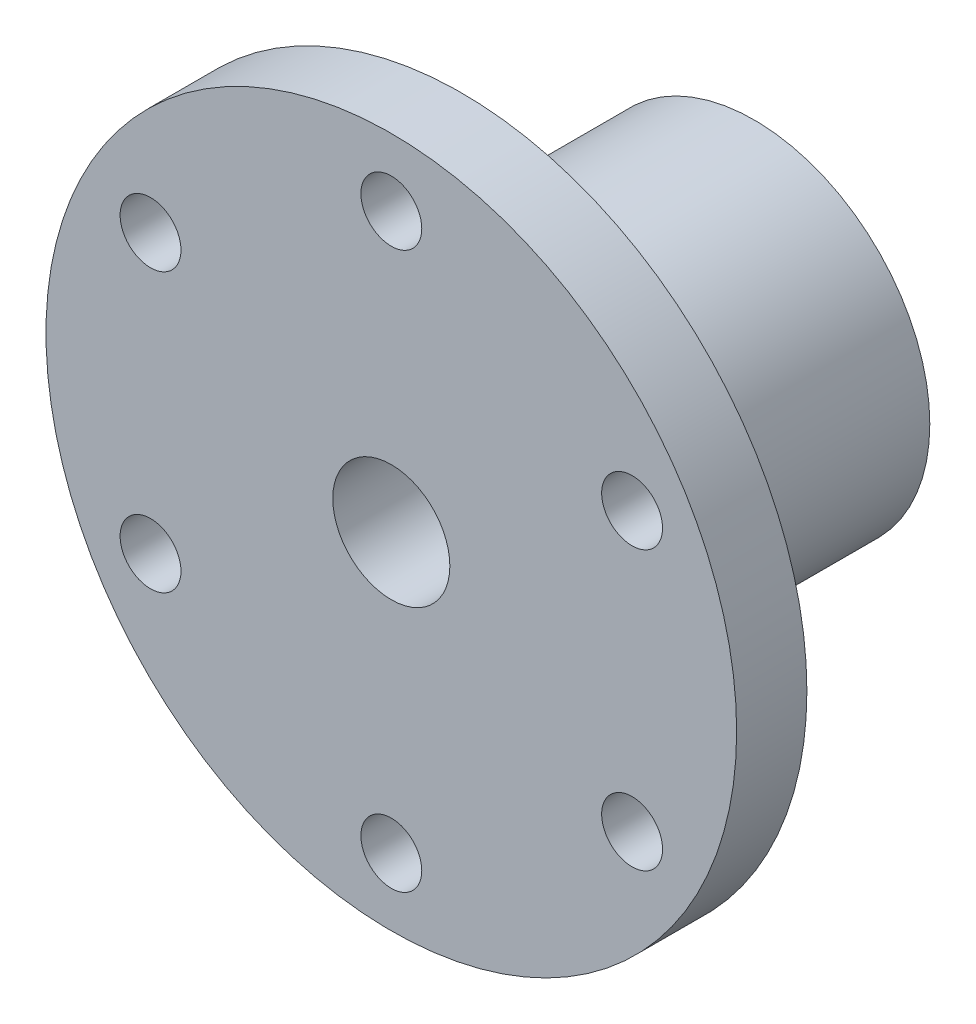
ISO-10303-21;
HEADER;
FILE_DESCRIPTION(('STEP AP214'),'2;1');
FILE_NAME('part.step','',(''),(''),'','','');
FILE_SCHEMA(('AUTOMOTIVE_DESIGN { 1 0 10303 214 1 1 1 1 }'));
ENDSEC;
DATA;
#1=APPLICATION_CONTEXT('core data for automotive mechanical design processes');
#2=APPLICATION_PROTOCOL_DEFINITION('international standard','automotive_design',2000,#1);
#3=PRODUCT_CONTEXT('',#1,'mechanical');
#4=PRODUCT('Part','Part','',(#3));
#5=PRODUCT_RELATED_PRODUCT_CATEGORY('part','',(#4));
#6=PRODUCT_DEFINITION_FORMATION('','',#4);
#7=PRODUCT_DEFINITION_CONTEXT('part definition',#1,'design');
#8=PRODUCT_DEFINITION('design','',#6,#7);
#9=PRODUCT_DEFINITION_SHAPE('','',#8);
#10=(LENGTH_UNIT() NAMED_UNIT(*) SI_UNIT(.MILLI.,.METRE.));
#11=(NAMED_UNIT(*) PLANE_ANGLE_UNIT() SI_UNIT($,.RADIAN.));
#12=(NAMED_UNIT(*) SI_UNIT($,.STERADIAN.) SOLID_ANGLE_UNIT());
#13=UNCERTAINTY_MEASURE_WITH_UNIT(LENGTH_MEASURE(1.E-05),#10,'distance_accuracy_value','');
#14=(GEOMETRIC_REPRESENTATION_CONTEXT(3) GLOBAL_UNCERTAINTY_ASSIGNED_CONTEXT((#13)) GLOBAL_UNIT_ASSIGNED_CONTEXT((#10,
#11,#12)) REPRESENTATION_CONTEXT('',''));
#15=CARTESIAN_POINT('',(0.,0.,0.));
#16=DIRECTION('',(0.,0.,1.));
#17=DIRECTION('',(1.,0.,0.));
#18=AXIS2_PLACEMENT_3D('',#15,#16,#17);
#19=CARTESIAN_POINT('',(0.,0.,6.));
#20=DIRECTION('',(0.,0.,1.));
#21=DIRECTION('',(1.,0.,0.));
#22=AXIS2_PLACEMENT_3D('',#19,#20,#21);
#23=PLANE('',#22);
#24=CARTESIAN_POINT('',(0.,0.,6.));
#25=DIRECTION('',(0.,0.,1.));
#26=DIRECTION('',(1.,0.,0.));
#27=AXIS2_PLACEMENT_3D('',#24,#25,#26);
#28=CIRCLE('',#27,5.);
#29=CARTESIAN_POINT('',(5.,0.,6.));
#30=VERTEX_POINT('',#29);
#31=EDGE_CURVE('E100',#30,#30,#28,.F.);
#32=ORIENTED_EDGE('',*,*,#31,.T.);
#33=EDGE_LOOP('',(#32));
#34=FACE_BOUND('',#33,.T.);
#35=CARTESIAN_POINT('',(-20.5681033398805,-11.8749999999998,6.));
#36=DIRECTION('',(0.,0.,1.));
#37=DIRECTION('',(1.,0.,0.));
#38=AXIS2_PLACEMENT_3D('',#35,#36,#37);
#39=CIRCLE('',#38,2.6);
#40=CARTESIAN_POINT('',(-17.9681033398805,-11.8749999999998,6.));
#41=VERTEX_POINT('',#40);
#42=EDGE_CURVE('E83',#41,#41,#39,.T.);
#43=ORIENTED_EDGE('',*,*,#42,.F.);
#44=EDGE_LOOP('',(#43));
#45=FACE_BOUND('',#44,.T.);
#46=CARTESIAN_POINT('',(20.5681033398804,-11.8750000000001,6.));
#47=DIRECTION('',(0.,0.,1.));
#48=DIRECTION('',(1.,0.,0.));
#49=AXIS2_PLACEMENT_3D('',#46,#47,#48);
#50=CIRCLE('',#49,2.6);
#51=CARTESIAN_POINT('',(23.1681033398804,-11.8750000000001,6.));
#52=VERTEX_POINT('',#51);
#53=EDGE_CURVE('E71',#52,#52,#50,.T.);
#54=ORIENTED_EDGE('',*,*,#53,.F.);
#55=EDGE_LOOP('',(#54));
#56=FACE_BOUND('',#55,.T.);
#57=CARTESIAN_POINT('',(0.,23.75,6.));
#58=DIRECTION('',(0.,0.,1.));
#59=DIRECTION('',(1.,0.,0.));
#60=AXIS2_PLACEMENT_3D('',#57,#58,#59);
#61=CIRCLE('',#60,2.6);
#62=CARTESIAN_POINT('',(2.6,23.75,6.));
#63=VERTEX_POINT('',#62);
#64=EDGE_CURVE('E60',#63,#63,#61,.T.);
#65=ORIENTED_EDGE('',*,*,#64,.F.);
#66=EDGE_LOOP('',(#65));
#67=FACE_BOUND('',#66,.T.);
#68=CARTESIAN_POINT('',(0.,0.,6.));
#69=DIRECTION('',(0.,0.,1.));
#70=DIRECTION('',(1.,0.,0.));
#71=AXIS2_PLACEMENT_3D('',#68,#69,#70);
#72=CIRCLE('',#71,29.5);
#73=CARTESIAN_POINT('',(29.5,0.,6.));
#74=VERTEX_POINT('',#73);
#75=EDGE_CURVE('E52',#74,#74,#72,.T.);
#76=ORIENTED_EDGE('',*,*,#75,.T.);
#77=EDGE_LOOP('',(#76));
#78=FACE_BOUND('',#77,.T.);
#79=CARTESIAN_POINT('',(20.5681033398804,11.875,6.));
#80=DIRECTION('',(0.,0.,1.));
#81=DIRECTION('',(1.,0.,0.));
#82=AXIS2_PLACEMENT_3D('',#79,#80,#81);
#83=CIRCLE('',#82,2.6);
#84=CARTESIAN_POINT('',(23.1681033398804,11.875,6.));
#85=VERTEX_POINT('',#84);
#86=EDGE_CURVE('E65',#85,#85,#83,.T.);
#87=ORIENTED_EDGE('',*,*,#86,.F.);
#88=EDGE_LOOP('',(#87));
#89=FACE_BOUND('',#88,.T.);
#90=CARTESIAN_POINT('',(-1.65845363595049E-13,-23.75,6.));
#91=DIRECTION('',(0.,0.,1.));
#92=DIRECTION('',(1.,0.,0.));
#93=AXIS2_PLACEMENT_3D('',#90,#91,#92);
#94=CIRCLE('',#93,2.6);
#95=CARTESIAN_POINT('',(2.59999999999983,-23.75,6.));
#96=VERTEX_POINT('',#95);
#97=EDGE_CURVE('E77',#96,#96,#94,.T.);
#98=ORIENTED_EDGE('',*,*,#97,.F.);
#99=EDGE_LOOP('',(#98));
#100=FACE_BOUND('',#99,.T.);
#101=CARTESIAN_POINT('',(-20.5681033398803,11.8750000000002,6.));
#102=DIRECTION('',(0.,0.,1.));
#103=DIRECTION('',(1.,0.,0.));
#104=AXIS2_PLACEMENT_3D('',#101,#102,#103);
#105=CIRCLE('',#104,2.6);
#106=CARTESIAN_POINT('',(-17.9681033398803,11.8750000000002,6.));
#107=VERTEX_POINT('',#106);
#108=EDGE_CURVE('E89',#107,#107,#105,.T.);
#109=ORIENTED_EDGE('',*,*,#108,.F.);
#110=EDGE_LOOP('',(#109));
#111=FACE_BOUND('',#110,.T.);
#112=ADVANCED_FACE('F41',(#34,#45,#56,#67,#78,#89,#100,#111),#23,.T.);
#113=CARTESIAN_POINT('',(0.,0.,0.));
#114=DIRECTION('',(0.,0.,1.));
#115=DIRECTION('',(1.,0.,0.));
#116=AXIS2_PLACEMENT_3D('',#113,#114,#115);
#117=PLANE('',#116);
#118=CARTESIAN_POINT('',(0.,0.,0.));
#119=DIRECTION('',(0.,0.,1.));
#120=DIRECTION('',(1.,0.,0.));
#121=AXIS2_PLACEMENT_3D('',#118,#119,#120);
#122=CIRCLE('',#121,15.9999999999966);
#123=CARTESIAN_POINT('',(15.9999999999966,0.,0.));
#124=VERTEX_POINT('',#123);
#125=EDGE_CURVE('E10',#124,#124,#122,.T.);
#126=ORIENTED_EDGE('',*,*,#125,.T.);
#127=EDGE_LOOP('',(#126));
#128=FACE_BOUND('',#127,.T.);
#129=CARTESIAN_POINT('',(0.,0.,0.));
#130=DIRECTION('',(0.,0.,1.));
#131=DIRECTION('',(1.,0.,0.));
#132=AXIS2_PLACEMENT_3D('',#129,#130,#131);
#133=CIRCLE('',#132,29.5);
#134=CARTESIAN_POINT('',(29.5,0.,0.));
#135=VERTEX_POINT('',#134);
#136=EDGE_CURVE('E56',#135,#135,#133,.T.);
#137=ORIENTED_EDGE('',*,*,#136,.F.);
#138=EDGE_LOOP('',(#137));
#139=FACE_BOUND('',#138,.T.);
#140=CARTESIAN_POINT('',(0.,23.75,0.));
#141=DIRECTION('',(0.,0.,1.));
#142=DIRECTION('',(1.,0.,0.));
#143=AXIS2_PLACEMENT_3D('',#140,#141,#142);
#144=CIRCLE('',#143,2.6);
#145=CARTESIAN_POINT('',(2.6,23.75,0.));
#146=VERTEX_POINT('',#145);
#147=EDGE_CURVE('E62',#146,#146,#144,.T.);
#148=ORIENTED_EDGE('',*,*,#147,.T.);
#149=EDGE_LOOP('',(#148));
#150=FACE_BOUND('',#149,.T.);
#151=CARTESIAN_POINT('',(20.5681033398804,11.875,0.));
#152=DIRECTION('',(0.,0.,1.));
#153=DIRECTION('',(1.,0.,0.));
#154=AXIS2_PLACEMENT_3D('',#151,#152,#153);
#155=CIRCLE('',#154,2.6);
#156=CARTESIAN_POINT('',(23.1681033398804,11.875,0.));
#157=VERTEX_POINT('',#156);
#158=EDGE_CURVE('E68',#157,#157,#155,.T.);
#159=ORIENTED_EDGE('',*,*,#158,.T.);
#160=EDGE_LOOP('',(#159));
#161=FACE_BOUND('',#160,.T.);
#162=CARTESIAN_POINT('',(20.5681033398804,-11.8750000000001,0.));
#163=DIRECTION('',(0.,0.,1.));
#164=DIRECTION('',(1.,0.,0.));
#165=AXIS2_PLACEMENT_3D('',#162,#163,#164);
#166=CIRCLE('',#165,2.6);
#167=CARTESIAN_POINT('',(23.1681033398804,-11.8750000000001,0.));
#168=VERTEX_POINT('',#167);
#169=EDGE_CURVE('E74',#168,#168,#166,.T.);
#170=ORIENTED_EDGE('',*,*,#169,.T.);
#171=EDGE_LOOP('',(#170));
#172=FACE_BOUND('',#171,.T.);
#173=CARTESIAN_POINT('',(-1.65845363595049E-13,-23.75,0.));
#174=DIRECTION('',(0.,0.,1.));
#175=DIRECTION('',(1.,0.,0.));
#176=AXIS2_PLACEMENT_3D('',#173,#174,#175);
#177=CIRCLE('',#176,2.6);
#178=CARTESIAN_POINT('',(2.59999999999983,-23.75,0.));
#179=VERTEX_POINT('',#178);
#180=EDGE_CURVE('E80',#179,#179,#177,.T.);
#181=ORIENTED_EDGE('',*,*,#180,.T.);
#182=EDGE_LOOP('',(#181));
#183=FACE_BOUND('',#182,.T.);
#184=CARTESIAN_POINT('',(-20.5681033398805,-11.8749999999998,0.));
#185=DIRECTION('',(0.,0.,1.));
#186=DIRECTION('',(1.,0.,0.));
#187=AXIS2_PLACEMENT_3D('',#184,#185,#186);
#188=CIRCLE('',#187,2.6);
#189=CARTESIAN_POINT('',(-17.9681033398805,-11.8749999999998,0.));
#190=VERTEX_POINT('',#189);
#191=EDGE_CURVE('E86',#190,#190,#188,.T.);
#192=ORIENTED_EDGE('',*,*,#191,.T.);
#193=EDGE_LOOP('',(#192));
#194=FACE_BOUND('',#193,.T.);
#195=CARTESIAN_POINT('',(-20.5681033398803,11.8750000000002,0.));
#196=DIRECTION('',(0.,0.,1.));
#197=DIRECTION('',(1.,0.,0.));
#198=AXIS2_PLACEMENT_3D('',#195,#196,#197);
#199=CIRCLE('',#198,2.6);
#200=CARTESIAN_POINT('',(-17.9681033398803,11.8750000000002,0.));
#201=VERTEX_POINT('',#200);
#202=EDGE_CURVE('E92',#201,#201,#199,.T.);
#203=ORIENTED_EDGE('',*,*,#202,.T.);
#204=EDGE_LOOP('',(#203));
#205=FACE_BOUND('',#204,.T.);
#206=ADVANCED_FACE('F127',(#128,#139,#150,#161,#172,#183,#194,#205),#117,.F.);
#207=CARTESIAN_POINT('',(0.,0.,6.));
#208=DIRECTION('',(0.,0.,-1.));
#209=DIRECTION('',(-1.,0.,0.));
#210=AXIS2_PLACEMENT_3D('',#207,#208,#209);
#211=CYLINDRICAL_SURFACE('',#210,29.5);
#212=ORIENTED_EDGE('',*,*,#75,.F.);
#213=EDGE_LOOP('',(#212));
#214=FACE_BOUND('',#213,.T.);
#215=ORIENTED_EDGE('',*,*,#136,.T.);
#216=EDGE_LOOP('',(#215));
#217=FACE_BOUND('',#216,.T.);
#218=ADVANCED_FACE('F132',(#214,#217),#211,.T.);
#219=CARTESIAN_POINT('',(0.,23.75,6.));
#220=DIRECTION('',(0.,0.,-1.));
#221=DIRECTION('',(-1.,0.,0.));
#222=AXIS2_PLACEMENT_3D('',#219,#220,#221);
#223=CYLINDRICAL_SURFACE('',#222,2.6);
#224=ORIENTED_EDGE('',*,*,#64,.T.);
#225=EDGE_LOOP('',(#224));
#226=FACE_BOUND('',#225,.T.);
#227=ORIENTED_EDGE('',*,*,#147,.F.);
#228=EDGE_LOOP('',(#227));
#229=FACE_BOUND('',#228,.T.);
#230=ADVANCED_FACE('F136',(#226,#229),#223,.F.);
#231=CARTESIAN_POINT('',(20.5681033398804,11.875,6.));
#232=DIRECTION('',(0.,0.,-1.));
#233=DIRECTION('',(-1.,0.,0.));
#234=AXIS2_PLACEMENT_3D('',#231,#232,#233);
#235=CYLINDRICAL_SURFACE('',#234,2.6);
#236=ORIENTED_EDGE('',*,*,#86,.T.);
#237=EDGE_LOOP('',(#236));
#238=FACE_BOUND('',#237,.T.);
#239=ORIENTED_EDGE('',*,*,#158,.F.);
#240=EDGE_LOOP('',(#239));
#241=FACE_BOUND('',#240,.T.);
#242=ADVANCED_FACE('F143',(#238,#241),#235,.F.);
#243=CARTESIAN_POINT('',(20.5681033398804,-11.8750000000001,6.));
#244=DIRECTION('',(0.,0.,-1.));
#245=DIRECTION('',(-1.,0.,0.));
#246=AXIS2_PLACEMENT_3D('',#243,#244,#245);
#247=CYLINDRICAL_SURFACE('',#246,2.6);
#248=ORIENTED_EDGE('',*,*,#53,.T.);
#249=EDGE_LOOP('',(#248));
#250=FACE_BOUND('',#249,.T.);
#251=ORIENTED_EDGE('',*,*,#169,.F.);
#252=EDGE_LOOP('',(#251));
#253=FACE_BOUND('',#252,.T.);
#254=ADVANCED_FACE('F175',(#250,#253),#247,.F.);
#255=CARTESIAN_POINT('',(-1.65845363595049E-13,-23.75,6.));
#256=DIRECTION('',(0.,0.,-1.));
#257=DIRECTION('',(-1.,0.,0.));
#258=AXIS2_PLACEMENT_3D('',#255,#256,#257);
#259=CYLINDRICAL_SURFACE('',#258,2.6);
#260=ORIENTED_EDGE('',*,*,#97,.T.);
#261=EDGE_LOOP('',(#260));
#262=FACE_BOUND('',#261,.T.);
#263=ORIENTED_EDGE('',*,*,#180,.F.);
#264=EDGE_LOOP('',(#263));
#265=FACE_BOUND('',#264,.T.);
#266=ADVANCED_FACE('F169',(#262,#265),#259,.F.);
#267=CARTESIAN_POINT('',(-20.5681033398805,-11.8749999999998,6.));
#268=DIRECTION('',(0.,0.,-1.));
#269=DIRECTION('',(-1.,0.,0.));
#270=AXIS2_PLACEMENT_3D('',#267,#268,#269);
#271=CYLINDRICAL_SURFACE('',#270,2.6);
#272=ORIENTED_EDGE('',*,*,#42,.T.);
#273=EDGE_LOOP('',(#272));
#274=FACE_BOUND('',#273,.T.);
#275=ORIENTED_EDGE('',*,*,#191,.F.);
#276=EDGE_LOOP('',(#275));
#277=FACE_BOUND('',#276,.T.);
#278=ADVANCED_FACE('F163',(#274,#277),#271,.F.);
#279=CARTESIAN_POINT('',(-20.5681033398803,11.8750000000002,6.));
#280=DIRECTION('',(0.,0.,-1.));
#281=DIRECTION('',(-1.,0.,0.));
#282=AXIS2_PLACEMENT_3D('',#279,#280,#281);
#283=CYLINDRICAL_SURFACE('',#282,2.6);
#284=ORIENTED_EDGE('',*,*,#108,.T.);
#285=EDGE_LOOP('',(#284));
#286=FACE_BOUND('',#285,.T.);
#287=ORIENTED_EDGE('',*,*,#202,.F.);
#288=EDGE_LOOP('',(#287));
#289=FACE_BOUND('',#288,.T.);
#290=ADVANCED_FACE('F114',(#286,#289),#283,.F.);
#291=CARTESIAN_POINT('',(0.,0.,-25.));
#292=DIRECTION('',(0.,0.,1.));
#293=DIRECTION('',(1.,0.,0.));
#294=AXIS2_PLACEMENT_3D('',#291,#292,#293);
#295=PLANE('',#294);
#296=CARTESIAN_POINT('',(0.,0.,-25.));
#297=DIRECTION('',(0.,0.,-1.));
#298=DIRECTION('',(-1.,0.,0.));
#299=AXIS2_PLACEMENT_3D('',#296,#297,#298);
#300=CIRCLE('',#299,5.);
#301=CARTESIAN_POINT('',(-5.,0.,-25.));
#302=VERTEX_POINT('',#301);
#303=EDGE_CURVE('E103',#302,#302,#300,.T.);
#304=ORIENTED_EDGE('',*,*,#303,.F.);
#305=EDGE_LOOP('',(#304));
#306=FACE_BOUND('',#305,.T.);
#307=CARTESIAN_POINT('',(0.,0.,-25.));
#308=DIRECTION('',(0.,0.,1.));
#309=DIRECTION('',(1.,0.,0.));
#310=AXIS2_PLACEMENT_3D('',#307,#308,#309);
#311=CIRCLE('',#310,15.);
#312=CARTESIAN_POINT('',(15.,0.,-25.));
#313=VERTEX_POINT('',#312);
#314=EDGE_CURVE('E95',#313,#313,#311,.T.);
#315=ORIENTED_EDGE('',*,*,#314,.F.);
#316=EDGE_LOOP('',(#315));
#317=FACE_BOUND('',#316,.T.);
#318=ADVANCED_FACE('F110',(#306,#317),#295,.F.);
#319=CARTESIAN_POINT('',(0.,0.,0.));
#320=DIRECTION('',(0.,0.,1.));
#321=DIRECTION('',(1.,0.,0.));
#322=AXIS2_PLACEMENT_3D('',#319,#320,#321);
#323=CYLINDRICAL_SURFACE('',#322,14.9999999999966);
#324=CARTESIAN_POINT('',(0.,0.,-1.));
#325=DIRECTION('',(0.,0.,1.));
#326=DIRECTION('',(1.,0.,0.));
#327=AXIS2_PLACEMENT_3D('',#324,#325,#326);
#328=CIRCLE('',#327,14.9999999999966);
#329=CARTESIAN_POINT('',(14.9999999999966,0.,-1.));
#330=VERTEX_POINT('',#329);
#331=EDGE_CURVE('E48',#330,#330,#328,.F.);
#332=ORIENTED_EDGE('',*,*,#331,.T.);
#333=EDGE_LOOP('',(#332));
#334=FACE_BOUND('',#333,.T.);
#335=ORIENTED_EDGE('',*,*,#314,.T.);
#336=EDGE_LOOP('',(#335));
#337=FACE_BOUND('',#336,.T.);
#338=ADVANCED_FACE('F113',(#334,#337),#323,.T.);
#339=CARTESIAN_POINT('',(0.,0.,-1.));
#340=DIRECTION('',(0.,0.,1.));
#341=DIRECTION('',(1.,0.,0.));
#342=AXIS2_PLACEMENT_3D('',#339,#340,#341);
#343=TOROIDAL_SURFACE('',#342,15.9999999999966,1.);
#344=ORIENTED_EDGE('',*,*,#125,.F.);
#345=EDGE_LOOP('',(#344));
#346=FACE_BOUND('',#345,.T.);
#347=ORIENTED_EDGE('',*,*,#331,.F.);
#348=EDGE_LOOP('',(#347));
#349=FACE_BOUND('',#348,.T.);
#350=ADVANCED_FACE('F43',(#346,#349),#343,.F.);
#351=CARTESIAN_POINT('',(0.,0.,20.142135623731));
#352=DIRECTION('',(0.,0.,-1.));
#353=DIRECTION('',(-1.,0.,0.));
#354=AXIS2_PLACEMENT_3D('',#351,#352,#353);
#355=CYLINDRICAL_SURFACE('',#354,5.);
#356=ORIENTED_EDGE('',*,*,#303,.T.);
#357=EDGE_LOOP('',(#356));
#358=FACE_BOUND('',#357,.T.);
#359=ORIENTED_EDGE('',*,*,#31,.F.);
#360=EDGE_LOOP('',(#359));
#361=FACE_BOUND('',#360,.T.);
#362=ADVANCED_FACE('F107',(#358,#361),#355,.F.);
#363=CLOSED_SHELL('',(#112,#206,#218,#230,#242,#254,#266,#278,#290,#318,#338,#350,#362));
#364=MANIFOLD_SOLID_BREP('B2',#363);
#365=ADVANCED_BREP_SHAPE_REPRESENTATION('',(#18,#364),#14);
#366=SHAPE_DEFINITION_REPRESENTATION(#9,#365);
ENDSEC;
END-ISO-10303-21;
